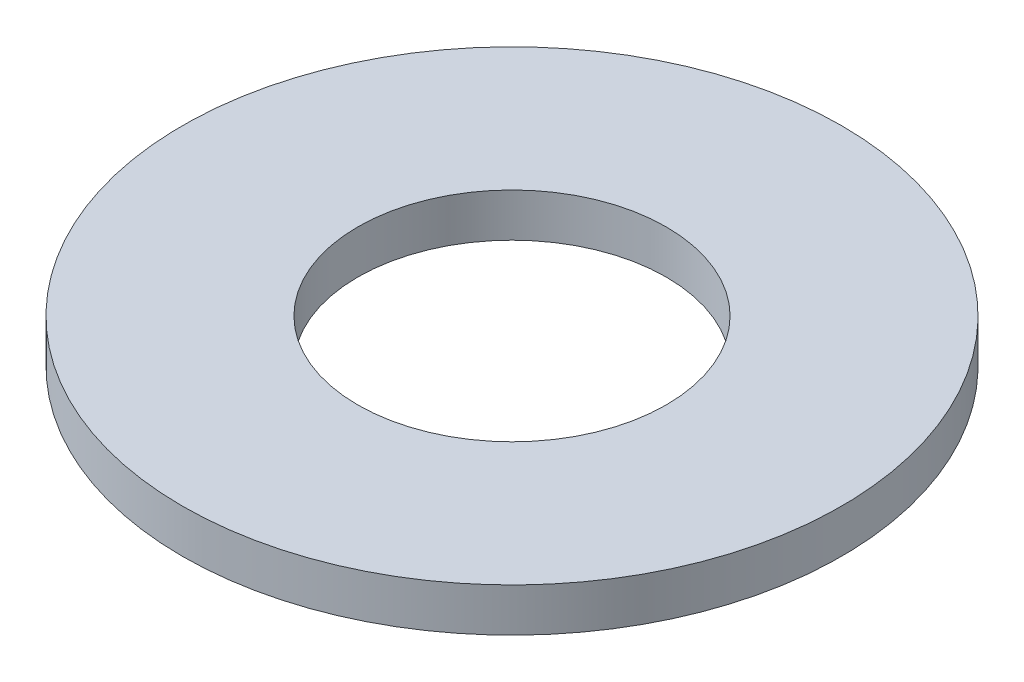
ISO-10303-21;
HEADER;
FILE_DESCRIPTION(('STEP AP214'),'2;1');
FILE_NAME('part.step','',(''),(''),'','','');
FILE_SCHEMA(('AUTOMOTIVE_DESIGN { 1 0 10303 214 1 1 1 1 }'));
ENDSEC;
DATA;
#1=APPLICATION_CONTEXT('core data for automotive mechanical design processes');
#2=APPLICATION_PROTOCOL_DEFINITION('international standard','automotive_design',2000,#1);
#3=PRODUCT_CONTEXT('',#1,'mechanical');
#4=PRODUCT('Part','Part','',(#3));
#5=PRODUCT_RELATED_PRODUCT_CATEGORY('part','',(#4));
#6=PRODUCT_DEFINITION_FORMATION('','',#4);
#7=PRODUCT_DEFINITION_CONTEXT('part definition',#1,'design');
#8=PRODUCT_DEFINITION('design','',#6,#7);
#9=PRODUCT_DEFINITION_SHAPE('','',#8);
#10=(LENGTH_UNIT() NAMED_UNIT(*) SI_UNIT(.MILLI.,.METRE.));
#11=(NAMED_UNIT(*) PLANE_ANGLE_UNIT() SI_UNIT($,.RADIAN.));
#12=(NAMED_UNIT(*) SI_UNIT($,.STERADIAN.) SOLID_ANGLE_UNIT());
#13=UNCERTAINTY_MEASURE_WITH_UNIT(LENGTH_MEASURE(1.E-05),#10,'distance_accuracy_value','');
#14=(GEOMETRIC_REPRESENTATION_CONTEXT(3) GLOBAL_UNCERTAINTY_ASSIGNED_CONTEXT((#13)) GLOBAL_UNIT_ASSIGNED_CONTEXT((#10,
#11,#12)) REPRESENTATION_CONTEXT('',''));
#15=CARTESIAN_POINT('',(0.,0.,0.));
#16=DIRECTION('',(0.,0.,1.));
#17=DIRECTION('',(1.,0.,0.));
#18=AXIS2_PLACEMENT_3D('',#15,#16,#17);
#19=CARTESIAN_POINT('',(0.,0.8382,0.));
#20=DIRECTION('',(0.,-1.,0.));
#21=DIRECTION('',(0.,0.,-1.));
#22=AXIS2_PLACEMENT_3D('',#19,#20,#21);
#23=CYLINDRICAL_SURFACE('',#22,6.35);
#24=CARTESIAN_POINT('',(0.,0.8382,0.));
#25=DIRECTION('',(0.,1.,0.));
#26=DIRECTION('',(0.,0.,1.));
#27=AXIS2_PLACEMENT_3D('',#24,#25,#26);
#28=CIRCLE('',#27,6.35);
#29=CARTESIAN_POINT('',(0.,0.8382,6.35));
#30=VERTEX_POINT('',#29);
#31=EDGE_CURVE('E10',#30,#30,#28,.T.);
#32=ORIENTED_EDGE('',*,*,#31,.F.);
#33=EDGE_LOOP('',(#32));
#34=FACE_BOUND('',#33,.T.);
#35=CARTESIAN_POINT('',(0.,0.,0.));
#36=DIRECTION('',(0.,1.,0.));
#37=DIRECTION('',(0.,0.,1.));
#38=AXIS2_PLACEMENT_3D('',#35,#36,#37);
#39=CIRCLE('',#38,6.35);
#40=CARTESIAN_POINT('',(0.,0.,6.35));
#41=VERTEX_POINT('',#40);
#42=EDGE_CURVE('E36',#41,#41,#39,.T.);
#43=ORIENTED_EDGE('',*,*,#42,.T.);
#44=EDGE_LOOP('',(#43));
#45=FACE_BOUND('',#44,.T.);
#46=ADVANCED_FACE('F33',(#34,#45),#23,.T.);
#47=CARTESIAN_POINT('',(0.,0.8382,0.));
#48=DIRECTION('',(0.,1.,0.));
#49=DIRECTION('',(0.,0.,1.));
#50=AXIS2_PLACEMENT_3D('',#47,#48,#49);
#51=PLANE('',#50);
#52=CARTESIAN_POINT('',(0.,0.8382,0.));
#53=DIRECTION('',(0.,1.,0.));
#54=DIRECTION('',(0.,0.,1.));
#55=AXIS2_PLACEMENT_3D('',#52,#53,#54);
#56=CIRCLE('',#55,2.9718);
#57=CARTESIAN_POINT('',(0.,0.8382,2.9718));
#58=VERTEX_POINT('',#57);
#59=EDGE_CURVE('E45',#58,#58,#56,.T.);
#60=ORIENTED_EDGE('',*,*,#59,.F.);
#61=EDGE_LOOP('',(#60));
#62=FACE_BOUND('',#61,.T.);
#63=ORIENTED_EDGE('',*,*,#31,.T.);
#64=EDGE_LOOP('',(#63));
#65=FACE_BOUND('',#64,.T.);
#66=ADVANCED_FACE('F60',(#62,#65),#51,.T.);
#67=CARTESIAN_POINT('',(0.,0.,0.));
#68=DIRECTION('',(0.,1.,0.));
#69=DIRECTION('',(0.,0.,1.));
#70=AXIS2_PLACEMENT_3D('',#67,#68,#69);
#71=PLANE('',#70);
#72=CARTESIAN_POINT('',(0.,0.,0.));
#73=DIRECTION('',(0.,1.,0.));
#74=DIRECTION('',(0.,0.,1.));
#75=AXIS2_PLACEMENT_3D('',#72,#73,#74);
#76=CIRCLE('',#75,2.9718);
#77=CARTESIAN_POINT('',(0.,0.,2.9718));
#78=VERTEX_POINT('',#77);
#79=EDGE_CURVE('E43',#78,#78,#76,.T.);
#80=ORIENTED_EDGE('',*,*,#79,.T.);
#81=EDGE_LOOP('',(#80));
#82=FACE_BOUND('',#81,.T.);
#83=ORIENTED_EDGE('',*,*,#42,.F.);
#84=EDGE_LOOP('',(#83));
#85=FACE_BOUND('',#84,.T.);
#86=ADVANCED_FACE('F51',(#82,#85),#71,.F.);
#87=CARTESIAN_POINT('',(0.,0.,0.));
#88=DIRECTION('',(0.,1.,0.));
#89=DIRECTION('',(0.,0.,1.));
#90=AXIS2_PLACEMENT_3D('',#87,#88,#89);
#91=CYLINDRICAL_SURFACE('',#90,2.9718);
#92=ORIENTED_EDGE('',*,*,#79,.F.);
#93=EDGE_LOOP('',(#92));
#94=FACE_BOUND('',#93,.T.);
#95=ORIENTED_EDGE('',*,*,#59,.T.);
#96=EDGE_LOOP('',(#95));
#97=FACE_BOUND('',#96,.T.);
#98=ADVANCED_FACE('F54',(#94,#97),#91,.F.);
#99=CLOSED_SHELL('',(#46,#66,#86,#98));
#100=MANIFOLD_SOLID_BREP('B2',#99);
#101=ADVANCED_BREP_SHAPE_REPRESENTATION('',(#18,#100),#14);
#102=SHAPE_DEFINITION_REPRESENTATION(#9,#101);
ENDSEC;
END-ISO-10303-21;
